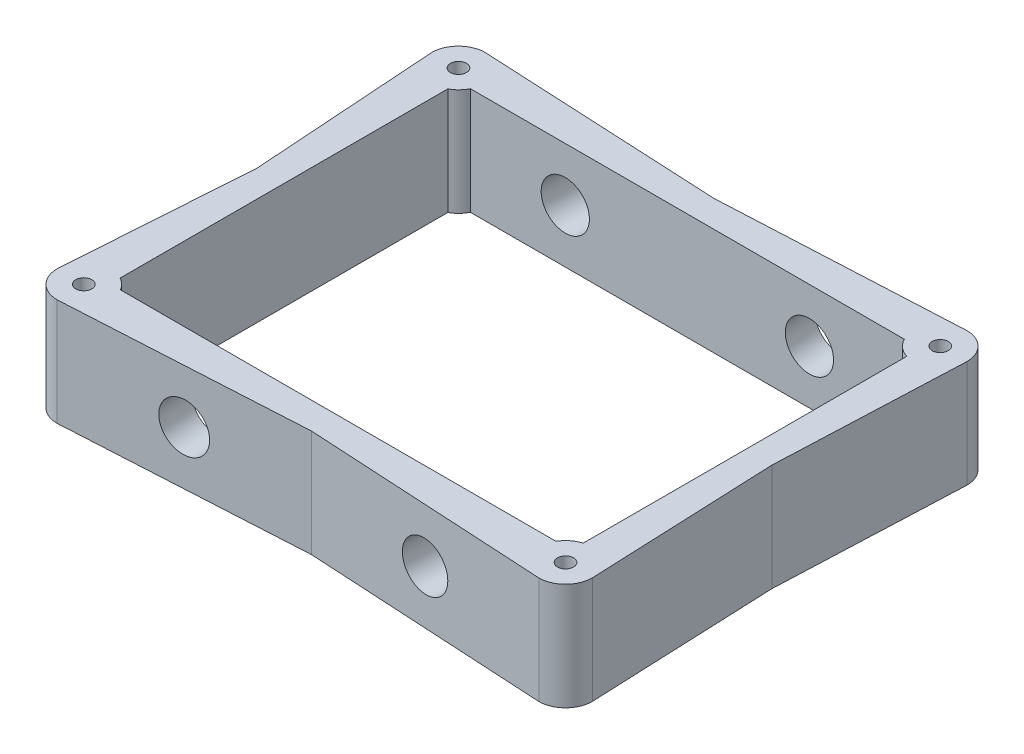
ISO-10303-21;
HEADER;
FILE_DESCRIPTION(('STEP AP214'),'2;1');
FILE_NAME('part.step','',(''),(''),'','','');
FILE_SCHEMA(('AUTOMOTIVE_DESIGN { 1 0 10303 214 1 1 1 1 }'));
ENDSEC;
DATA;
#1=APPLICATION_CONTEXT('core data for automotive mechanical design processes');
#2=APPLICATION_PROTOCOL_DEFINITION('international standard','automotive_design',2000,#1);
#3=PRODUCT_CONTEXT('',#1,'mechanical');
#4=PRODUCT('Part','Part','',(#3));
#5=PRODUCT_RELATED_PRODUCT_CATEGORY('part','',(#4));
#6=PRODUCT_DEFINITION_FORMATION('','',#4);
#7=PRODUCT_DEFINITION_CONTEXT('part definition',#1,'design');
#8=PRODUCT_DEFINITION('design','',#6,#7);
#9=PRODUCT_DEFINITION_SHAPE('','',#8);
#10=(LENGTH_UNIT() NAMED_UNIT(*) SI_UNIT(.MILLI.,.METRE.));
#11=(NAMED_UNIT(*) PLANE_ANGLE_UNIT() SI_UNIT($,.RADIAN.));
#12=(NAMED_UNIT(*) SI_UNIT($,.STERADIAN.) SOLID_ANGLE_UNIT());
#13=UNCERTAINTY_MEASURE_WITH_UNIT(LENGTH_MEASURE(1.E-05),#10,'distance_accuracy_value','');
#14=(GEOMETRIC_REPRESENTATION_CONTEXT(3) GLOBAL_UNCERTAINTY_ASSIGNED_CONTEXT((#13)) GLOBAL_UNIT_ASSIGNED_CONTEXT((#10,
#11,#12)) REPRESENTATION_CONTEXT('',''));
#15=CARTESIAN_POINT('',(0.,0.,0.));
#16=DIRECTION('',(0.,0.,1.));
#17=DIRECTION('',(1.,0.,0.));
#18=AXIS2_PLACEMENT_3D('',#15,#16,#17);
#19=CARTESIAN_POINT('',(-1.87638591590573,20.,-37.6647051964881));
#20=DIRECTION('',(0.049756443837666,0.,0.998761381059875));
#21=DIRECTION('',(0.998761381059875,0.,-0.049756443837666));
#22=AXIS2_PLACEMENT_3D('',#19,#20,#21);
#23=PLANE('',#22);
#24=DIRECTION('',(-0.998761381059875,0.,0.049756443837666));
#25=VECTOR('',#24,1.);
#26=CARTESIAN_POINT('',(-1.87638591590573,0.,-37.6647051964881));
#27=LINE('',#26,#25);
#28=CARTESIAN_POINT('',(45.,0.,-40.));
#29=VERTEX_POINT('',#28);
#30=CARTESIAN_POINT('',(1.31422650540003E-11,0.,-37.7581832706444));
#31=VERTEX_POINT('',#30);
#32=EDGE_CURVE('E273',#29,#31,#27,.T.);
#33=ORIENTED_EDGE('',*,*,#32,.T.);
#34=DIRECTION('',(0.,-1.,0.));
#35=VECTOR('',#34,1.);
#36=CARTESIAN_POINT('',(1.31422650540003E-11,20.,-37.7581832706444));
#37=LINE('',#36,#35);
#38=CARTESIAN_POINT('',(1.31422650540003E-11,20.,-37.7581832706444));
#39=VERTEX_POINT('',#38);
#40=EDGE_CURVE('E195',#39,#31,#37,.T.);
#41=ORIENTED_EDGE('',*,*,#40,.F.);
#42=DIRECTION('',(-0.998761381059875,0.,0.049756443837666));
#43=VECTOR('',#42,1.);
#44=CARTESIAN_POINT('',(-1.87638591590573,20.,-37.6647051964881));
#45=LINE('',#44,#43);
#46=CARTESIAN_POINT('',(45.,20.,-40.));
#47=VERTEX_POINT('',#46);
#48=EDGE_CURVE('E204',#47,#39,#45,.T.);
#49=ORIENTED_EDGE('',*,*,#48,.F.);
#50=DIRECTION('',(0.,-1.,0.));
#51=VECTOR('',#50,1.);
#52=CARTESIAN_POINT('',(45.,20.,-40.));
#53=LINE('',#52,#51);
#54=EDGE_CURVE('E284',#47,#29,#53,.T.);
#55=ORIENTED_EDGE('',*,*,#54,.T.);
#56=EDGE_LOOP('',(#33,#41,#49,#55));
#57=FACE_BOUND('',#56,.T.);
#58=CARTESIAN_POINT('',(22.5000000000066,10.,-38.8790916353222));
#59=DIRECTION('',(-0.049756443837666,0.,-0.998761381059875));
#60=DIRECTION('',(-0.998761381059875,0.,0.049756443837666));
#61=AXIS2_PLACEMENT_3D('',#58,#59,#60);
#62=CIRCLE('',#61,4.49999999999999);
#63=CARTESIAN_POINT('',(18.0055737852371,10.,-38.6551876380527));
#64=VERTEX_POINT('',#63);
#65=EDGE_CURVE('E519',#64,#64,#62,.T.);
#66=ORIENTED_EDGE('',*,*,#65,.F.);
#67=EDGE_LOOP('',(#66));
#68=FACE_BOUND('',#67,.T.);
#69=ADVANCED_FACE('F37',(#57,#68),#23,.F.);
#70=CARTESIAN_POINT('',(2.0973133440241,20.,37.3557534050209));
#71=DIRECTION('',(-0.0560560392466513,0.,-0.998427624048923));
#72=DIRECTION('',(-0.998427624048923,0.,0.0560560392466513));
#73=AXIS2_PLACEMENT_3D('',#70,#71,#72);
#74=PLANE('',#73);
#75=DIRECTION('',(0.998427624048923,0.,-0.0560560392466513));
#76=VECTOR('',#75,1.);
#77=CARTESIAN_POINT('',(2.0973133440241,0.,37.3557534050209));
#78=LINE('',#77,#76);
#79=CARTESIAN_POINT('',(-45.,0.,40.));
#80=VERTEX_POINT('',#79);
#81=CARTESIAN_POINT('',(0.,0.,37.4735056349205));
#82=VERTEX_POINT('',#81);
#83=EDGE_CURVE('E255',#80,#82,#78,.T.);
#84=ORIENTED_EDGE('',*,*,#83,.T.);
#85=DIRECTION('',(0.,-1.,0.));
#86=VECTOR('',#85,1.);
#87=CARTESIAN_POINT('',(0.,20.,37.4735056349205));
#88=LINE('',#87,#86);
#89=CARTESIAN_POINT('',(0.,20.,37.4735056349205));
#90=VERTEX_POINT('',#89);
#91=EDGE_CURVE('E299',#90,#82,#88,.T.);
#92=ORIENTED_EDGE('',*,*,#91,.F.);
#93=DIRECTION('',(0.998427624048923,0.,-0.0560560392466513));
#94=VECTOR('',#93,1.);
#95=CARTESIAN_POINT('',(2.0973133440241,20.,37.3557534050209));
#96=LINE('',#95,#94);
#97=CARTESIAN_POINT('',(-45.,20.,40.));
#98=VERTEX_POINT('',#97);
#99=EDGE_CURVE('E376',#98,#90,#96,.T.);
#100=ORIENTED_EDGE('',*,*,#99,.F.);
#101=DIRECTION('',(0.,-1.,0.));
#102=VECTOR('',#101,1.);
#103=CARTESIAN_POINT('',(-45.,20.,40.));
#104=LINE('',#103,#102);
#105=EDGE_CURVE('E47',#98,#80,#104,.T.);
#106=ORIENTED_EDGE('',*,*,#105,.T.);
#107=EDGE_LOOP('',(#84,#92,#100,#106));
#108=FACE_BOUND('',#107,.T.);
#109=CARTESIAN_POINT('',(-22.5,10.,38.7367528174603));
#110=DIRECTION('',(0.0560560392466513,0.,0.998427624048923));
#111=DIRECTION('',(0.998427624048923,0.,-0.0560560392466513));
#112=AXIS2_PLACEMENT_3D('',#109,#110,#111);
#113=CIRCLE('',#112,4.49999999999999);
#114=CARTESIAN_POINT('',(-18.0070756917799,10.,38.4845006408503));
#115=VERTEX_POINT('',#114);
#116=EDGE_CURVE('E507',#115,#115,#113,.T.);
#117=ORIENTED_EDGE('',*,*,#116,.F.);
#118=EDGE_LOOP('',(#117));
#119=FACE_BOUND('',#118,.T.);
#120=ADVANCED_FACE('F414',(#108,#119),#74,.F.);
#121=CARTESIAN_POINT('',(-47.3900773621706,20.,-3.2348603977943));
#122=DIRECTION('',(-0.997678376445637,0.,-0.0681018147540725));
#123=DIRECTION('',(-0.0681018147540725,0.,0.997678376445637));
#124=AXIS2_PLACEMENT_3D('',#121,#122,#123);
#125=PLANE('',#124);
#126=DIRECTION('',(0.0681018147540725,0.,-0.997678376445637));
#127=VECTOR('',#126,1.);
#128=CARTESIAN_POINT('',(-47.3900773621706,0.,-3.2348603977943));
#129=LINE('',#128,#127);
#130=CARTESIAN_POINT('',(-50.,0.,35.));
#131=VERTEX_POINT('',#130);
#132=CARTESIAN_POINT('',(-47.6108898692542,0.,3.7470027081099E-12));
#133=VERTEX_POINT('',#132);
#134=EDGE_CURVE('E250',#131,#133,#129,.T.);
#135=ORIENTED_EDGE('',*,*,#134,.F.);
#136=DIRECTION('',(0.,-1.,0.));
#137=VECTOR('',#136,1.);
#138=CARTESIAN_POINT('',(-50.,20.,35.));
#139=LINE('',#138,#137);
#140=CARTESIAN_POINT('',(-50.,20.,35.));
#141=VERTEX_POINT('',#140);
#142=EDGE_CURVE('E11',#141,#131,#139,.T.);
#143=ORIENTED_EDGE('',*,*,#142,.F.);
#144=DIRECTION('',(0.0681018147540725,0.,-0.997678376445637));
#145=VECTOR('',#144,1.);
#146=CARTESIAN_POINT('',(-47.3900773621706,20.,-3.2348603977943));
#147=LINE('',#146,#145);
#148=CARTESIAN_POINT('',(-47.6108898692542,20.,3.7470027081099E-12));
#149=VERTEX_POINT('',#148);
#150=EDGE_CURVE('E371',#141,#149,#147,.T.);
#151=ORIENTED_EDGE('',*,*,#150,.T.);
#152=DIRECTION('',(0.,-1.,0.));
#153=VECTOR('',#152,1.);
#154=CARTESIAN_POINT('',(-47.6108898692542,20.,3.7470027081099E-12));
#155=LINE('',#154,#153);
#156=EDGE_CURVE('E127',#149,#133,#155,.T.);
#157=ORIENTED_EDGE('',*,*,#156,.T.);
#158=EDGE_LOOP('',(#135,#143,#151,#157));
#159=FACE_BOUND('',#158,.T.);
#160=ADVANCED_FACE('F419',(#159),#125,.T.);
#161=CARTESIAN_POINT('',(-45.,20.,35.));
#162=DIRECTION('',(0.,-1.,0.));
#163=DIRECTION('',(0.,0.,-1.));
#164=AXIS2_PLACEMENT_3D('',#161,#162,#163);
#165=CYLINDRICAL_SURFACE('',#164,5.);
#166=CARTESIAN_POINT('',(-45.,0.,35.));
#167=DIRECTION('',(0.,1.,0.));
#168=DIRECTION('',(0.,0.,1.));
#169=AXIS2_PLACEMENT_3D('',#166,#167,#168);
#170=CIRCLE('',#169,5.);
#171=EDGE_CURVE('E252',#131,#80,#170,.T.);
#172=ORIENTED_EDGE('',*,*,#171,.T.);
#173=ORIENTED_EDGE('',*,*,#105,.F.);
#174=CARTESIAN_POINT('',(-45.,20.,35.));
#175=DIRECTION('',(0.,1.,0.));
#176=DIRECTION('',(0.,0.,1.));
#177=AXIS2_PLACEMENT_3D('',#174,#175,#176);
#178=CIRCLE('',#177,5.);
#179=EDGE_CURVE('E373',#141,#98,#178,.T.);
#180=ORIENTED_EDGE('',*,*,#179,.F.);
#181=ORIENTED_EDGE('',*,*,#142,.T.);
#182=EDGE_LOOP('',(#172,#173,#180,#181));
#183=FACE_BOUND('',#182,.T.);
#184=ADVANCED_FACE('F441',(#183),#165,.T.);
#185=CARTESIAN_POINT('',(-2.0973133440241,20.,37.3557534050209));
#186=DIRECTION('',(0.0560560392466513,0.,-0.998427624048923));
#187=DIRECTION('',(-0.998427624048923,0.,-0.0560560392466513));
#188=AXIS2_PLACEMENT_3D('',#185,#186,#187);
#189=PLANE('',#188);
#190=CARTESIAN_POINT('',(22.5,10.,38.7367528174603));
#191=DIRECTION('',(-0.0560560392466514,0.,0.998427624048923));
#192=DIRECTION('',(0.998427624048923,0.,0.0560560392466514));
#193=AXIS2_PLACEMENT_3D('',#190,#191,#192);
#194=CIRCLE('',#193,4.49999999999999);
#195=CARTESIAN_POINT('',(26.9929243082201,10.,38.9890049940702));
#196=VERTEX_POINT('',#195);
#197=EDGE_CURVE('E513',#196,#196,#194,.T.);
#198=ORIENTED_EDGE('',*,*,#197,.F.);
#199=EDGE_LOOP('',(#198));
#200=FACE_BOUND('',#199,.T.);
#201=DIRECTION('',(0.998427624048923,0.,0.0560560392466514));
#202=VECTOR('',#201,1.);
#203=CARTESIAN_POINT('',(-2.0973133440241,0.,37.3557534050209));
#204=LINE('',#203,#202);
#205=CARTESIAN_POINT('',(45.,0.,40.));
#206=VERTEX_POINT('',#205);
#207=EDGE_CURVE('E258',#82,#206,#204,.T.);
#208=ORIENTED_EDGE('',*,*,#207,.T.);
#209=DIRECTION('',(0.,-1.,0.));
#210=VECTOR('',#209,1.);
#211=CARTESIAN_POINT('',(45.,20.,40.));
#212=LINE('',#211,#210);
#213=CARTESIAN_POINT('',(45.,20.,40.));
#214=VERTEX_POINT('',#213);
#215=EDGE_CURVE('E296',#214,#206,#212,.T.);
#216=ORIENTED_EDGE('',*,*,#215,.F.);
#217=DIRECTION('',(0.998427624048923,0.,0.0560560392466514));
#218=VECTOR('',#217,1.);
#219=CARTESIAN_POINT('',(-2.0973133440241,20.,37.3557534050209));
#220=LINE('',#219,#218);
#221=EDGE_CURVE('E379',#90,#214,#220,.T.);
#222=ORIENTED_EDGE('',*,*,#221,.F.);
#223=ORIENTED_EDGE('',*,*,#91,.T.);
#224=EDGE_LOOP('',(#208,#216,#222,#223));
#225=FACE_BOUND('',#224,.T.);
#226=ADVANCED_FACE('F438',(#200,#225),#189,.F.);
#227=CARTESIAN_POINT('',(45.,20.,35.));
#228=DIRECTION('',(0.,-1.,0.));
#229=DIRECTION('',(0.,0.,-1.));
#230=AXIS2_PLACEMENT_3D('',#227,#228,#229);
#231=CYLINDRICAL_SURFACE('',#230,4.99999999999999);
#232=CARTESIAN_POINT('',(45.,0.,35.));
#233=DIRECTION('',(0.,1.,0.));
#234=DIRECTION('',(0.,0.,1.));
#235=AXIS2_PLACEMENT_3D('',#232,#233,#234);
#236=CIRCLE('',#235,4.99999999999999);
#237=CARTESIAN_POINT('',(50.,0.,35.));
#238=VERTEX_POINT('',#237);
#239=EDGE_CURVE('E261',#206,#238,#236,.T.);
#240=ORIENTED_EDGE('',*,*,#239,.T.);
#241=DIRECTION('',(0.,-1.,0.));
#242=VECTOR('',#241,1.);
#243=CARTESIAN_POINT('',(50.,20.,35.));
#244=LINE('',#243,#242);
#245=CARTESIAN_POINT('',(50.,20.,35.));
#246=VERTEX_POINT('',#245);
#247=EDGE_CURVE('E293',#246,#238,#244,.T.);
#248=ORIENTED_EDGE('',*,*,#247,.F.);
#249=CARTESIAN_POINT('',(45.,20.,35.));
#250=DIRECTION('',(0.,1.,0.));
#251=DIRECTION('',(0.,0.,1.));
#252=AXIS2_PLACEMENT_3D('',#249,#250,#251);
#253=CIRCLE('',#252,4.99999999999999);
#254=EDGE_CURVE('E382',#214,#246,#253,.T.);
#255=ORIENTED_EDGE('',*,*,#254,.F.);
#256=ORIENTED_EDGE('',*,*,#215,.T.);
#257=EDGE_LOOP('',(#240,#248,#255,#256));
#258=FACE_BOUND('',#257,.T.);
#259=ADVANCED_FACE('F434',(#258),#231,.T.);
#260=CARTESIAN_POINT('',(48.4436627956674,20.,-2.03572815952969));
#261=DIRECTION('',(-0.999118218662636,0.,0.0419855348471417));
#262=DIRECTION('',(0.0419855348471417,0.,0.999118218662636));
#263=AXIS2_PLACEMENT_3D('',#260,#261,#262);
#264=PLANE('',#263);
#265=DIRECTION('',(-0.0419855348471417,0.,-0.999118218662636));
#266=VECTOR('',#265,1.);
#267=CARTESIAN_POINT('',(48.4436627956674,0.,-2.03572815952969));
#268=LINE('',#267,#266);
#269=CARTESIAN_POINT('',(48.5292093646171,0.,1.28226422535516E-11));
#270=VERTEX_POINT('',#269);
#271=EDGE_CURVE('E264',#238,#270,#268,.T.);
#272=ORIENTED_EDGE('',*,*,#271,.T.);
#273=DIRECTION('',(0.,-1.,0.));
#274=VECTOR('',#273,1.);
#275=CARTESIAN_POINT('',(48.5292093646171,20.,1.28226422535516E-11));
#276=LINE('',#275,#274);
#277=CARTESIAN_POINT('',(48.5292093646171,20.,1.28226422535516E-11));
#278=VERTEX_POINT('',#277);
#279=EDGE_CURVE('E290',#278,#270,#276,.T.);
#280=ORIENTED_EDGE('',*,*,#279,.F.);
#281=DIRECTION('',(-0.0419855348471417,0.,-0.999118218662636));
#282=VECTOR('',#281,1.);
#283=CARTESIAN_POINT('',(48.4436627956674,20.,-2.03572815952969));
#284=LINE('',#283,#282);
#285=EDGE_CURVE('E385',#246,#278,#284,.T.);
#286=ORIENTED_EDGE('',*,*,#285,.F.);
#287=ORIENTED_EDGE('',*,*,#247,.T.);
#288=EDGE_LOOP('',(#272,#280,#286,#287));
#289=FACE_BOUND('',#288,.T.);
#290=ADVANCED_FACE('F430',(#289),#264,.F.);
#291=CARTESIAN_POINT('',(48.4436627956686,20.,2.03572815952825));
#292=DIRECTION('',(-0.999118218662638,0.,-0.041985534847111));
#293=DIRECTION('',(-0.041985534847111,0.,0.999118218662638));
#294=AXIS2_PLACEMENT_3D('',#291,#292,#293);
#295=PLANE('',#294);
#296=DIRECTION('',(0.041985534847111,0.,-0.999118218662638));
#297=VECTOR('',#296,1.);
#298=CARTESIAN_POINT('',(48.4436627956686,0.,2.03572815952825));
#299=LINE('',#298,#297);
#300=CARTESIAN_POINT('',(50.,0.,-35.));
#301=VERTEX_POINT('',#300);
#302=EDGE_CURVE('E267',#270,#301,#299,.T.);
#303=ORIENTED_EDGE('',*,*,#302,.T.);
#304=DIRECTION('',(0.,-1.,0.));
#305=VECTOR('',#304,1.);
#306=CARTESIAN_POINT('',(50.,20.,-35.));
#307=LINE('',#306,#305);
#308=CARTESIAN_POINT('',(50.,20.,-35.));
#309=VERTEX_POINT('',#308);
#310=EDGE_CURVE('E287',#309,#301,#307,.T.);
#311=ORIENTED_EDGE('',*,*,#310,.F.);
#312=DIRECTION('',(0.041985534847111,0.,-0.999118218662638));
#313=VECTOR('',#312,1.);
#314=CARTESIAN_POINT('',(48.4436627956686,20.,2.03572815952825));
#315=LINE('',#314,#313);
#316=EDGE_CURVE('E388',#278,#309,#315,.T.);
#317=ORIENTED_EDGE('',*,*,#316,.F.);
#318=ORIENTED_EDGE('',*,*,#279,.T.);
#319=EDGE_LOOP('',(#303,#311,#317,#318));
#320=FACE_BOUND('',#319,.T.);
#321=ADVANCED_FACE('F427',(#320),#295,.F.);
#322=CARTESIAN_POINT('',(45.,20.,-35.));
#323=DIRECTION('',(0.,-1.,0.));
#324=DIRECTION('',(0.,0.,-1.));
#325=AXIS2_PLACEMENT_3D('',#322,#323,#324);
#326=CYLINDRICAL_SURFACE('',#325,5.);
#327=CARTESIAN_POINT('',(45.,0.,-35.));
#328=DIRECTION('',(0.,1.,0.));
#329=DIRECTION('',(0.,0.,1.));
#330=AXIS2_PLACEMENT_3D('',#327,#328,#329);
#331=CIRCLE('',#330,5.);
#332=EDGE_CURVE('E270',#301,#29,#331,.T.);
#333=ORIENTED_EDGE('',*,*,#332,.T.);
#334=ORIENTED_EDGE('',*,*,#54,.F.);
#335=CARTESIAN_POINT('',(45.,20.,-35.));
#336=DIRECTION('',(0.,1.,0.));
#337=DIRECTION('',(0.,0.,1.));
#338=AXIS2_PLACEMENT_3D('',#335,#336,#337);
#339=CIRCLE('',#338,5.);
#340=EDGE_CURVE('E207',#309,#47,#339,.T.);
#341=ORIENTED_EDGE('',*,*,#340,.F.);
#342=ORIENTED_EDGE('',*,*,#310,.T.);
#343=EDGE_LOOP('',(#333,#334,#341,#342));
#344=FACE_BOUND('',#343,.T.);
#345=ADVANCED_FACE('F393',(#344),#326,.T.);
#346=CARTESIAN_POINT('',(1.8763859159047,20.,-37.6647051964895));
#347=DIRECTION('',(0.049756443837637,0.,-0.998761381059877));
#348=DIRECTION('',(-0.998761381059877,0.,-0.049756443837637));
#349=AXIS2_PLACEMENT_3D('',#346,#347,#348);
#350=PLANE('',#349);
#351=CARTESIAN_POINT('',(-22.4999999999934,10.,-38.8790916353222));
#352=DIRECTION('',(0.049756443837637,0.,-0.998761381059877));
#353=DIRECTION('',(-0.998761381059877,0.,-0.049756443837637));
#354=AXIS2_PLACEMENT_3D('',#351,#352,#353);
#355=CIRCLE('',#354,4.49999999999999);
#356=CARTESIAN_POINT('',(-26.9944262147629,10.,-39.1029956325916));
#357=VERTEX_POINT('',#356);
#358=EDGE_CURVE('E525',#357,#357,#355,.T.);
#359=ORIENTED_EDGE('',*,*,#358,.F.);
#360=EDGE_LOOP('',(#359));
#361=FACE_BOUND('',#360,.T.);
#362=DIRECTION('',(0.998761381059877,0.,0.049756443837637));
#363=VECTOR('',#362,1.);
#364=CARTESIAN_POINT('',(1.8763859159047,0.,-37.6647051964895));
#365=LINE('',#364,#363);
#366=CARTESIAN_POINT('',(-45.,0.,-40.));
#367=VERTEX_POINT('',#366);
#368=EDGE_CURVE('E192',#367,#31,#365,.T.);
#369=ORIENTED_EDGE('',*,*,#368,.F.);
#370=DIRECTION('',(0.,-1.,0.));
#371=VECTOR('',#370,1.);
#372=CARTESIAN_POINT('',(-45.,20.,-40.));
#373=LINE('',#372,#371);
#374=CARTESIAN_POINT('',(-45.,20.,-40.));
#375=VERTEX_POINT('',#374);
#376=EDGE_CURVE('E186',#375,#367,#373,.T.);
#377=ORIENTED_EDGE('',*,*,#376,.F.);
#378=DIRECTION('',(0.998761381059877,0.,0.049756443837637));
#379=VECTOR('',#378,1.);
#380=CARTESIAN_POINT('',(1.8763859159047,20.,-37.6647051964895));
#381=LINE('',#380,#379);
#382=EDGE_CURVE('E190',#375,#39,#381,.T.);
#383=ORIENTED_EDGE('',*,*,#382,.T.);
#384=ORIENTED_EDGE('',*,*,#40,.T.);
#385=EDGE_LOOP('',(#369,#377,#383,#384));
#386=FACE_BOUND('',#385,.T.);
#387=ADVANCED_FACE('F188',(#361,#386),#350,.T.);
#388=CARTESIAN_POINT('',(-45.,20.,-35.));
#389=DIRECTION('',(0.,-1.,0.));
#390=DIRECTION('',(0.,0.,-1.));
#391=AXIS2_PLACEMENT_3D('',#388,#389,#390);
#392=CYLINDRICAL_SURFACE('',#391,4.99999999999999);
#393=CARTESIAN_POINT('',(-45.,0.,-35.));
#394=DIRECTION('',(0.,1.,0.));
#395=DIRECTION('',(0.,0.,1.));
#396=AXIS2_PLACEMENT_3D('',#393,#394,#395);
#397=CIRCLE('',#396,4.99999999999999);
#398=CARTESIAN_POINT('',(-50.,0.,-35.));
#399=VERTEX_POINT('',#398);
#400=EDGE_CURVE('E277',#367,#399,#397,.T.);
#401=ORIENTED_EDGE('',*,*,#400,.T.);
#402=DIRECTION('',(0.,-1.,0.));
#403=VECTOR('',#402,1.);
#404=CARTESIAN_POINT('',(-50.,20.,-35.));
#405=LINE('',#404,#403);
#406=CARTESIAN_POINT('',(-50.,20.,-35.));
#407=VERTEX_POINT('',#406);
#408=EDGE_CURVE('E196',#407,#399,#405,.T.);
#409=ORIENTED_EDGE('',*,*,#408,.F.);
#410=CARTESIAN_POINT('',(-45.,20.,-35.));
#411=DIRECTION('',(0.,1.,0.));
#412=DIRECTION('',(0.,0.,1.));
#413=AXIS2_PLACEMENT_3D('',#410,#411,#412);
#414=CIRCLE('',#413,4.99999999999999);
#415=EDGE_CURVE('E199',#375,#407,#414,.T.);
#416=ORIENTED_EDGE('',*,*,#415,.F.);
#417=ORIENTED_EDGE('',*,*,#376,.T.);
#418=EDGE_LOOP('',(#401,#409,#416,#417));
#419=FACE_BOUND('',#418,.T.);
#420=ADVANCED_FACE('F200',(#419),#392,.T.);
#421=CARTESIAN_POINT('',(43.5292093646171,20.,0.));
#422=DIRECTION('',(-1.,0.,0.));
#423=DIRECTION('',(0.,0.,1.));
#424=AXIS2_PLACEMENT_3D('',#421,#422,#423);
#425=PLANE('',#424);
#426=DIRECTION('',(0.,0.,-1.));
#427=VECTOR('',#426,1.);
#428=CARTESIAN_POINT('',(43.5292093646171,0.,0.));
#429=LINE('',#428,#427);
#430=CARTESIAN_POINT('',(43.5292093646171,0.,30.2212161686398));
#431=VERTEX_POINT('',#430);
#432=CARTESIAN_POINT('',(43.5292093646171,0.,-30.2212161686398));
#433=VERTEX_POINT('',#432);
#434=EDGE_CURVE('E226',#431,#433,#429,.T.);
#435=ORIENTED_EDGE('',*,*,#434,.F.);
#436=DIRECTION('',(0.,-1.,0.));
#437=VECTOR('',#436,1.);
#438=CARTESIAN_POINT('',(43.5292093646171,20.,30.2212161686398));
#439=LINE('',#438,#437);
#440=CARTESIAN_POINT('',(43.5292093646171,20.,30.2212161686398));
#441=VERTEX_POINT('',#440);
#442=EDGE_CURVE('E41',#441,#431,#439,.T.);
#443=ORIENTED_EDGE('',*,*,#442,.F.);
#444=DIRECTION('',(0.,0.,-1.));
#445=VECTOR('',#444,1.);
#446=CARTESIAN_POINT('',(43.5292093646171,20.,0.));
#447=LINE('',#446,#445);
#448=CARTESIAN_POINT('',(43.5292093646171,20.,-30.2212161686398));
#449=VERTEX_POINT('',#448);
#450=EDGE_CURVE('E333',#441,#449,#447,.T.);
#451=ORIENTED_EDGE('',*,*,#450,.T.);
#452=DIRECTION('',(0.,-1.,0.));
#453=VECTOR('',#452,1.);
#454=CARTESIAN_POINT('',(43.5292093646171,20.,-30.2212161686398));
#455=LINE('',#454,#453);
#456=EDGE_CURVE('E212',#449,#433,#455,.T.);
#457=ORIENTED_EDGE('',*,*,#456,.T.);
#458=EDGE_LOOP('',(#435,#443,#451,#457));
#459=FACE_BOUND('',#458,.T.);
#460=ADVANCED_FACE('F331',(#459),#425,.T.);
#461=CARTESIAN_POINT('',(45.,20.,35.));
#462=DIRECTION('',(0.,-1.,0.));
#463=DIRECTION('',(0.,0.,-1.));
#464=AXIS2_PLACEMENT_3D('',#461,#462,#463);
#465=CYLINDRICAL_SURFACE('',#464,5.);
#466=CARTESIAN_POINT('',(45.,0.,35.));
#467=DIRECTION('',(0.,1.,0.));
#468=DIRECTION('',(0.,0.,1.));
#469=AXIS2_PLACEMENT_3D('',#466,#467,#468);
#470=CIRCLE('',#469,5.);
#471=CARTESIAN_POINT('',(40.6852779668649,0.,32.4735056349205));
#472=VERTEX_POINT('',#471);
#473=EDGE_CURVE('E229',#431,#472,#470,.T.);
#474=ORIENTED_EDGE('',*,*,#473,.T.);
#475=DIRECTION('',(0.,-1.,0.));
#476=VECTOR('',#475,1.);
#477=CARTESIAN_POINT('',(40.6852779668649,20.,32.4735056349205));
#478=LINE('',#477,#476);
#479=CARTESIAN_POINT('',(40.6852779668649,20.,32.4735056349205));
#480=VERTEX_POINT('',#479);
#481=EDGE_CURVE('E318',#480,#472,#478,.T.);
#482=ORIENTED_EDGE('',*,*,#481,.F.);
#483=CARTESIAN_POINT('',(45.,20.,35.));
#484=DIRECTION('',(0.,1.,0.));
#485=DIRECTION('',(0.,0.,1.));
#486=AXIS2_PLACEMENT_3D('',#483,#484,#485);
#487=CIRCLE('',#486,5.);
#488=EDGE_CURVE('E326',#441,#480,#487,.T.);
#489=ORIENTED_EDGE('',*,*,#488,.F.);
#490=ORIENTED_EDGE('',*,*,#442,.T.);
#491=EDGE_LOOP('',(#474,#482,#489,#490));
#492=FACE_BOUND('',#491,.T.);
#493=ADVANCED_FACE('F325',(#492),#465,.T.);
#494=CARTESIAN_POINT('',(0.,20.,32.4735056349205));
#495=DIRECTION('',(0.,0.,-1.));
#496=DIRECTION('',(-1.,0.,0.));
#497=AXIS2_PLACEMENT_3D('',#494,#495,#496);
#498=PLANE('',#497);
#499=CARTESIAN_POINT('',(22.8516457491952,10.,32.4735056349205));
#500=DIRECTION('',(0.,0.,-1.));
#501=DIRECTION('',(-1.,0.,0.));
#502=AXIS2_PLACEMENT_3D('',#499,#500,#501);
#503=ELLIPSE('',#502,4.50708683494868,4.49999999999999);
#504=CARTESIAN_POINT('',(18.3445589142466,10.,32.4735056349205));
#505=VERTEX_POINT('',#504);
#506=EDGE_CURVE('E510',#505,#505,#503,.T.);
#507=ORIENTED_EDGE('',*,*,#506,.F.);
#508=EDGE_LOOP('',(#507));
#509=FACE_BOUND('',#508,.T.);
#510=CARTESIAN_POINT('',(-22.8516457491953,10.,32.4735056349205));
#511=DIRECTION('',(0.,0.,-1.));
#512=DIRECTION('',(1.,0.,0.));
#513=AXIS2_PLACEMENT_3D('',#510,#511,#512);
#514=ELLIPSE('',#513,4.50708683494868,4.49999999999999);
#515=CARTESIAN_POINT('',(-18.3445589142466,10.,32.4735056349205));
#516=VERTEX_POINT('',#515);
#517=EDGE_CURVE('E217',#516,#516,#514,.T.);
#518=ORIENTED_EDGE('',*,*,#517,.F.);
#519=EDGE_LOOP('',(#518));
#520=FACE_BOUND('',#519,.T.);
#521=DIRECTION('',(1.,0.,0.));
#522=VECTOR('',#521,1.);
#523=CARTESIAN_POINT('',(0.,0.,32.4735056349205));
#524=LINE('',#523,#522);
#525=CARTESIAN_POINT('',(-40.6852779668649,0.,32.4735056349205));
#526=VERTEX_POINT('',#525);
#527=EDGE_CURVE('E232',#526,#472,#524,.T.);
#528=ORIENTED_EDGE('',*,*,#527,.F.);
#529=DIRECTION('',(0.,-1.,0.));
#530=VECTOR('',#529,1.);
#531=CARTESIAN_POINT('',(-40.6852779668649,20.,32.4735056349205));
#532=LINE('',#531,#530);
#533=CARTESIAN_POINT('',(-40.6852779668649,20.,32.4735056349205));
#534=VERTEX_POINT('',#533);
#535=EDGE_CURVE('E317',#534,#526,#532,.T.);
#536=ORIENTED_EDGE('',*,*,#535,.F.);
#537=DIRECTION('',(1.,0.,0.));
#538=VECTOR('',#537,1.);
#539=CARTESIAN_POINT('',(0.,20.,32.4735056349205));
#540=LINE('',#539,#538);
#541=EDGE_CURVE('E355',#534,#480,#540,.T.);
#542=ORIENTED_EDGE('',*,*,#541,.T.);
#543=ORIENTED_EDGE('',*,*,#481,.T.);
#544=EDGE_LOOP('',(#528,#536,#542,#543));
#545=FACE_BOUND('',#544,.T.);
#546=ADVANCED_FACE('F352',(#509,#520,#545),#498,.T.);
#547=CARTESIAN_POINT('',(-45.,20.,35.));
#548=DIRECTION('',(0.,-1.,0.));
#549=DIRECTION('',(0.,0.,-1.));
#550=AXIS2_PLACEMENT_3D('',#547,#548,#549);
#551=CYLINDRICAL_SURFACE('',#550,4.99999999999999);
#552=CARTESIAN_POINT('',(-45.,0.,35.));
#553=DIRECTION('',(0.,1.,0.));
#554=DIRECTION('',(0.,0.,1.));
#555=AXIS2_PLACEMENT_3D('',#552,#553,#554);
#556=CIRCLE('',#555,4.99999999999999);
#557=CARTESIAN_POINT('',(-42.6108898692542,0.,30.6077166777213));
#558=VERTEX_POINT('',#557);
#559=EDGE_CURVE('E235',#526,#558,#556,.T.);
#560=ORIENTED_EDGE('',*,*,#559,.T.);
#561=DIRECTION('',(0.,-1.,0.));
#562=VECTOR('',#561,1.);
#563=CARTESIAN_POINT('',(-42.6108898692542,20.,30.6077166777213));
#564=LINE('',#563,#562);
#565=CARTESIAN_POINT('',(-42.6108898692542,20.,30.6077166777213));
#566=VERTEX_POINT('',#565);
#567=EDGE_CURVE('E314',#566,#558,#564,.T.);
#568=ORIENTED_EDGE('',*,*,#567,.F.);
#569=CARTESIAN_POINT('',(-45.,20.,35.));
#570=DIRECTION('',(0.,1.,0.));
#571=DIRECTION('',(0.,0.,1.));
#572=AXIS2_PLACEMENT_3D('',#569,#570,#571);
#573=CIRCLE('',#572,4.99999999999999);
#574=EDGE_CURVE('E357',#534,#566,#573,.T.);
#575=ORIENTED_EDGE('',*,*,#574,.F.);
#576=ORIENTED_EDGE('',*,*,#535,.T.);
#577=EDGE_LOOP('',(#560,#568,#575,#576));
#578=FACE_BOUND('',#577,.T.);
#579=ADVANCED_FACE('F358',(#578),#551,.T.);
#580=CARTESIAN_POINT('',(-42.6108898692542,20.,0.));
#581=DIRECTION('',(-1.,0.,0.));
#582=DIRECTION('',(0.,0.,1.));
#583=AXIS2_PLACEMENT_3D('',#580,#581,#582);
#584=PLANE('',#583);
#585=DIRECTION('',(0.,0.,-1.));
#586=VECTOR('',#585,1.);
#587=CARTESIAN_POINT('',(-42.6108898692542,0.,0.));
#588=LINE('',#587,#586);
#589=CARTESIAN_POINT('',(-42.6108898692542,0.,-30.6077166777213));
#590=VERTEX_POINT('',#589);
#591=EDGE_CURVE('E238',#558,#590,#588,.T.);
#592=ORIENTED_EDGE('',*,*,#591,.T.);
#593=DIRECTION('',(0.,-1.,0.));
#594=VECTOR('',#593,1.);
#595=CARTESIAN_POINT('',(-42.6108898692542,20.,-30.6077166777213));
#596=LINE('',#595,#594);
#597=CARTESIAN_POINT('',(-42.6108898692542,20.,-30.6077166777213));
#598=VERTEX_POINT('',#597);
#599=EDGE_CURVE('E311',#598,#590,#596,.T.);
#600=ORIENTED_EDGE('',*,*,#599,.F.);
#601=DIRECTION('',(0.,0.,-1.));
#602=VECTOR('',#601,1.);
#603=CARTESIAN_POINT('',(-42.6108898692542,20.,0.));
#604=LINE('',#603,#602);
#605=EDGE_CURVE('E360',#566,#598,#604,.T.);
#606=ORIENTED_EDGE('',*,*,#605,.F.);
#607=ORIENTED_EDGE('',*,*,#567,.T.);
#608=EDGE_LOOP('',(#592,#600,#606,#607));
#609=FACE_BOUND('',#608,.T.);
#610=ADVANCED_FACE('F349',(#609),#584,.F.);
#611=CARTESIAN_POINT('',(-45.,20.,-35.));
#612=DIRECTION('',(0.,-1.,0.));
#613=DIRECTION('',(0.,0.,-1.));
#614=AXIS2_PLACEMENT_3D('',#611,#612,#613);
#615=CYLINDRICAL_SURFACE('',#614,5.);
#616=CARTESIAN_POINT('',(-45.,0.,-35.));
#617=DIRECTION('',(0.,1.,0.));
#618=DIRECTION('',(0.,0.,1.));
#619=AXIS2_PLACEMENT_3D('',#616,#617,#618);
#620=CIRCLE('',#619,5.);
#621=CARTESIAN_POINT('',(-40.5307430425202,0.,-32.7581832706444));
#622=VERTEX_POINT('',#621);
#623=EDGE_CURVE('E241',#590,#622,#620,.T.);
#624=ORIENTED_EDGE('',*,*,#623,.T.);
#625=DIRECTION('',(0.,-1.,0.));
#626=VECTOR('',#625,1.);
#627=CARTESIAN_POINT('',(-40.5307430425202,20.,-32.7581832706444));
#628=LINE('',#627,#626);
#629=CARTESIAN_POINT('',(-40.5307430425202,20.,-32.7581832706444));
#630=VERTEX_POINT('',#629);
#631=EDGE_CURVE('E308',#630,#622,#628,.T.);
#632=ORIENTED_EDGE('',*,*,#631,.F.);
#633=CARTESIAN_POINT('',(-45.,20.,-35.));
#634=DIRECTION('',(0.,1.,0.));
#635=DIRECTION('',(0.,0.,1.));
#636=AXIS2_PLACEMENT_3D('',#633,#634,#635);
#637=CIRCLE('',#636,5.);
#638=EDGE_CURVE('E346',#598,#630,#637,.T.);
#639=ORIENTED_EDGE('',*,*,#638,.F.);
#640=ORIENTED_EDGE('',*,*,#599,.T.);
#641=EDGE_LOOP('',(#624,#632,#639,#640));
#642=FACE_BOUND('',#641,.T.);
#643=ADVANCED_FACE('F344',(#642),#615,.T.);
#644=CARTESIAN_POINT('',(0.,20.,-32.7581832706444));
#645=DIRECTION('',(0.,0.,-1.));
#646=DIRECTION('',(-1.,0.,0.));
#647=AXIS2_PLACEMENT_3D('',#644,#645,#646);
#648=PLANE('',#647);
#649=CARTESIAN_POINT('',(-22.8049323282331,10.,-32.7581832706444));
#650=DIRECTION('',(0.,0.,-1.));
#651=DIRECTION('',(1.,0.,0.));
#652=AXIS2_PLACEMENT_3D('',#649,#650,#651);
#653=ELLIPSE('',#652,4.50558069758828,4.49999999999999);
#654=CARTESIAN_POINT('',(-18.2993516306448,10.,-32.7581832706444));
#655=VERTEX_POINT('',#654);
#656=EDGE_CURVE('E522',#655,#655,#653,.T.);
#657=ORIENTED_EDGE('',*,*,#656,.T.);
#658=EDGE_LOOP('',(#657));
#659=FACE_BOUND('',#658,.T.);
#660=CARTESIAN_POINT('',(22.8049323282464,10.,-32.7581832706444));
#661=DIRECTION('',(0.,0.,-1.));
#662=DIRECTION('',(-1.,0.,0.));
#663=AXIS2_PLACEMENT_3D('',#660,#661,#662);
#664=ELLIPSE('',#663,4.50558069758829,4.49999999999999);
#665=CARTESIAN_POINT('',(18.2993516306581,10.,-32.7581832706444));
#666=VERTEX_POINT('',#665);
#667=EDGE_CURVE('E516',#666,#666,#664,.T.);
#668=ORIENTED_EDGE('',*,*,#667,.T.);
#669=EDGE_LOOP('',(#668));
#670=FACE_BOUND('',#669,.T.);
#671=DIRECTION('',(1.,0.,0.));
#672=VECTOR('',#671,1.);
#673=CARTESIAN_POINT('',(0.,0.,-32.7581832706444));
#674=LINE('',#673,#672);
#675=CARTESIAN_POINT('',(40.5307430425202,0.,-32.7581832706444));
#676=VERTEX_POINT('',#675);
#677=EDGE_CURVE('E244',#622,#676,#674,.T.);
#678=ORIENTED_EDGE('',*,*,#677,.T.);
#679=DIRECTION('',(0.,-1.,0.));
#680=VECTOR('',#679,1.);
#681=CARTESIAN_POINT('',(40.5307430425202,20.,-32.7581832706444));
#682=LINE('',#681,#680);
#683=CARTESIAN_POINT('',(40.5307430425202,20.,-32.7581832706444));
#684=VERTEX_POINT('',#683);
#685=EDGE_CURVE('E305',#684,#676,#682,.T.);
#686=ORIENTED_EDGE('',*,*,#685,.F.);
#687=DIRECTION('',(1.,0.,0.));
#688=VECTOR('',#687,1.);
#689=CARTESIAN_POINT('',(0.,20.,-32.7581832706444));
#690=LINE('',#689,#688);
#691=EDGE_CURVE('E341',#630,#684,#690,.T.);
#692=ORIENTED_EDGE('',*,*,#691,.F.);
#693=ORIENTED_EDGE('',*,*,#631,.T.);
#694=EDGE_LOOP('',(#678,#686,#692,#693));
#695=FACE_BOUND('',#694,.T.);
#696=ADVANCED_FACE('F339',(#659,#670,#695),#648,.F.);
#697=CARTESIAN_POINT('',(45.,20.,-35.));
#698=DIRECTION('',(0.,-1.,0.));
#699=DIRECTION('',(0.,0.,-1.));
#700=AXIS2_PLACEMENT_3D('',#697,#698,#699);
#701=CYLINDRICAL_SURFACE('',#700,5.);
#702=CARTESIAN_POINT('',(45.,0.,-35.));
#703=DIRECTION('',(0.,1.,0.));
#704=DIRECTION('',(0.,0.,1.));
#705=AXIS2_PLACEMENT_3D('',#702,#703,#704);
#706=CIRCLE('',#705,5.);
#707=EDGE_CURVE('E247',#676,#433,#706,.T.);
#708=ORIENTED_EDGE('',*,*,#707,.T.);
#709=ORIENTED_EDGE('',*,*,#456,.F.);
#710=CARTESIAN_POINT('',(45.,20.,-35.));
#711=DIRECTION('',(0.,1.,0.));
#712=DIRECTION('',(0.,0.,1.));
#713=AXIS2_PLACEMENT_3D('',#710,#711,#712);
#714=CIRCLE('',#713,5.);
#715=EDGE_CURVE('E369',#684,#449,#714,.T.);
#716=ORIENTED_EDGE('',*,*,#715,.F.);
#717=ORIENTED_EDGE('',*,*,#685,.T.);
#718=EDGE_LOOP('',(#708,#709,#716,#717));
#719=FACE_BOUND('',#718,.T.);
#720=ADVANCED_FACE('F335',(#719),#701,.T.);
#721=CARTESIAN_POINT('',(45.,20.,-35.));
#722=DIRECTION('',(0.,-1.,0.));
#723=DIRECTION('',(0.,0.,-1.));
#724=AXIS2_PLACEMENT_3D('',#721,#722,#723);
#725=CYLINDRICAL_SURFACE('',#724,1.5);
#726=CARTESIAN_POINT('',(45.,20.,-35.));
#727=DIRECTION('',(0.,1.,0.));
#728=DIRECTION('',(0.,0.,1.));
#729=AXIS2_PLACEMENT_3D('',#726,#727,#728);
#730=CIRCLE('',#729,1.5);
#731=CARTESIAN_POINT('',(45.,20.,-33.5));
#732=VERTEX_POINT('',#731);
#733=EDGE_CURVE('E496',#732,#732,#730,.T.);
#734=ORIENTED_EDGE('',*,*,#733,.T.);
#735=EDGE_LOOP('',(#734));
#736=FACE_BOUND('',#735,.T.);
#737=CARTESIAN_POINT('',(45.,0.,-35.));
#738=DIRECTION('',(0.,1.,0.));
#739=DIRECTION('',(0.,0.,1.));
#740=AXIS2_PLACEMENT_3D('',#737,#738,#739);
#741=CIRCLE('',#740,1.5);
#742=CARTESIAN_POINT('',(45.,0.,-33.5));
#743=VERTEX_POINT('',#742);
#744=EDGE_CURVE('E223',#743,#743,#741,.T.);
#745=ORIENTED_EDGE('',*,*,#744,.F.);
#746=EDGE_LOOP('',(#745));
#747=FACE_BOUND('',#746,.T.);
#748=ADVANCED_FACE('F451',(#736,#747),#725,.F.);
#749=CARTESIAN_POINT('',(45.,20.,35.));
#750=DIRECTION('',(0.,-1.,0.));
#751=DIRECTION('',(0.,0.,-1.));
#752=AXIS2_PLACEMENT_3D('',#749,#750,#751);
#753=CYLINDRICAL_SURFACE('',#752,1.5);
#754=CARTESIAN_POINT('',(45.,20.,35.));
#755=DIRECTION('',(0.,1.,0.));
#756=DIRECTION('',(0.,0.,1.));
#757=AXIS2_PLACEMENT_3D('',#754,#755,#756);
#758=CIRCLE('',#757,1.5);
#759=CARTESIAN_POINT('',(45.,20.,36.5));
#760=VERTEX_POINT('',#759);
#761=EDGE_CURVE('E493',#760,#760,#758,.T.);
#762=ORIENTED_EDGE('',*,*,#761,.T.);
#763=EDGE_LOOP('',(#762));
#764=FACE_BOUND('',#763,.T.);
#765=CARTESIAN_POINT('',(45.,0.,35.));
#766=DIRECTION('',(0.,1.,0.));
#767=DIRECTION('',(0.,0.,1.));
#768=AXIS2_PLACEMENT_3D('',#765,#766,#767);
#769=CIRCLE('',#768,1.5);
#770=CARTESIAN_POINT('',(45.,0.,36.5));
#771=VERTEX_POINT('',#770);
#772=EDGE_CURVE('E220',#771,#771,#769,.T.);
#773=ORIENTED_EDGE('',*,*,#772,.F.);
#774=EDGE_LOOP('',(#773));
#775=FACE_BOUND('',#774,.T.);
#776=ADVANCED_FACE('F470',(#764,#775),#753,.F.);
#777=CARTESIAN_POINT('',(-45.,20.,35.));
#778=DIRECTION('',(0.,-1.,0.));
#779=DIRECTION('',(0.,0.,-1.));
#780=AXIS2_PLACEMENT_3D('',#777,#778,#779);
#781=CYLINDRICAL_SURFACE('',#780,1.5);
#782=CARTESIAN_POINT('',(-45.,20.,35.));
#783=DIRECTION('',(0.,1.,0.));
#784=DIRECTION('',(0.,0.,1.));
#785=AXIS2_PLACEMENT_3D('',#782,#783,#784);
#786=CIRCLE('',#785,1.5);
#787=CARTESIAN_POINT('',(-45.,20.,36.5));
#788=VERTEX_POINT('',#787);
#789=EDGE_CURVE('E484',#788,#788,#786,.T.);
#790=ORIENTED_EDGE('',*,*,#789,.T.);
#791=EDGE_LOOP('',(#790));
#792=FACE_BOUND('',#791,.T.);
#793=CARTESIAN_POINT('',(-45.,0.,35.));
#794=DIRECTION('',(0.,1.,0.));
#795=DIRECTION('',(0.,0.,1.));
#796=AXIS2_PLACEMENT_3D('',#793,#794,#795);
#797=CIRCLE('',#796,1.5);
#798=CARTESIAN_POINT('',(-45.,0.,36.5));
#799=VERTEX_POINT('',#798);
#800=EDGE_CURVE('E216',#799,#799,#797,.T.);
#801=ORIENTED_EDGE('',*,*,#800,.F.);
#802=EDGE_LOOP('',(#801));
#803=FACE_BOUND('',#802,.T.);
#804=ADVANCED_FACE('F473',(#792,#803),#781,.F.);
#805=CARTESIAN_POINT('',(-45.,20.,-35.));
#806=DIRECTION('',(0.,-1.,0.));
#807=DIRECTION('',(0.,0.,-1.));
#808=AXIS2_PLACEMENT_3D('',#805,#806,#807);
#809=CYLINDRICAL_SURFACE('',#808,1.5);
#810=CARTESIAN_POINT('',(-45.,20.,-35.));
#811=DIRECTION('',(0.,1.,0.));
#812=DIRECTION('',(0.,0.,1.));
#813=AXIS2_PLACEMENT_3D('',#810,#811,#812);
#814=CIRCLE('',#813,1.5);
#815=CARTESIAN_POINT('',(-45.,20.,-33.5));
#816=VERTEX_POINT('',#815);
#817=EDGE_CURVE('E280',#816,#816,#814,.T.);
#818=ORIENTED_EDGE('',*,*,#817,.T.);
#819=EDGE_LOOP('',(#818));
#820=FACE_BOUND('',#819,.T.);
#821=CARTESIAN_POINT('',(-45.,0.,-35.));
#822=DIRECTION('',(0.,1.,0.));
#823=DIRECTION('',(0.,0.,1.));
#824=AXIS2_PLACEMENT_3D('',#821,#822,#823);
#825=CIRCLE('',#824,1.5);
#826=CARTESIAN_POINT('',(-45.,0.,-33.5));
#827=VERTEX_POINT('',#826);
#828=EDGE_CURVE('E213',#827,#827,#825,.T.);
#829=ORIENTED_EDGE('',*,*,#828,.F.);
#830=EDGE_LOOP('',(#829));
#831=FACE_BOUND('',#830,.T.);
#832=ADVANCED_FACE('F39',(#820,#831),#809,.F.);
#833=CARTESIAN_POINT('',(-47.3900773621712,20.,3.23486039779365));
#834=DIRECTION('',(0.997678376445638,0.,-0.068101814754058));
#835=DIRECTION('',(-0.068101814754058,0.,-0.997678376445638));
#836=AXIS2_PLACEMENT_3D('',#833,#834,#835);
#837=PLANE('',#836);
#838=DIRECTION('',(0.068101814754058,0.,0.997678376445638));
#839=VECTOR('',#838,1.);
#840=CARTESIAN_POINT('',(-47.3900773621712,0.,3.23486039779365));
#841=LINE('',#840,#839);
#842=EDGE_CURVE('E120',#399,#133,#841,.T.);
#843=ORIENTED_EDGE('',*,*,#842,.T.);
#844=ORIENTED_EDGE('',*,*,#156,.F.);
#845=DIRECTION('',(0.068101814754058,0.,0.997678376445638));
#846=VECTOR('',#845,1.);
#847=CARTESIAN_POINT('',(-47.3900773621712,20.,3.23486039779365));
#848=LINE('',#847,#846);
#849=EDGE_CURVE('E56',#407,#149,#848,.T.);
#850=ORIENTED_EDGE('',*,*,#849,.F.);
#851=ORIENTED_EDGE('',*,*,#408,.T.);
#852=EDGE_LOOP('',(#843,#844,#850,#851));
#853=FACE_BOUND('',#852,.T.);
#854=ADVANCED_FACE('F408',(#853),#837,.F.);
#855=CARTESIAN_POINT('',(0.,20.,0.));
#856=DIRECTION('',(0.,1.,0.));
#857=DIRECTION('',(0.,0.,1.));
#858=AXIS2_PLACEMENT_3D('',#855,#856,#857);
#859=PLANE('',#858);
#860=ORIENTED_EDGE('',*,*,#817,.F.);
#861=EDGE_LOOP('',(#860));
#862=FACE_BOUND('',#861,.T.);
#863=ORIENTED_EDGE('',*,*,#789,.F.);
#864=EDGE_LOOP('',(#863));
#865=FACE_BOUND('',#864,.T.);
#866=ORIENTED_EDGE('',*,*,#761,.F.);
#867=EDGE_LOOP('',(#866));
#868=FACE_BOUND('',#867,.T.);
#869=ORIENTED_EDGE('',*,*,#733,.F.);
#870=EDGE_LOOP('',(#869));
#871=FACE_BOUND('',#870,.T.);
#872=ORIENTED_EDGE('',*,*,#450,.F.);
#873=ORIENTED_EDGE('',*,*,#488,.T.);
#874=ORIENTED_EDGE('',*,*,#541,.F.);
#875=ORIENTED_EDGE('',*,*,#574,.T.);
#876=ORIENTED_EDGE('',*,*,#605,.T.);
#877=ORIENTED_EDGE('',*,*,#638,.T.);
#878=ORIENTED_EDGE('',*,*,#691,.T.);
#879=ORIENTED_EDGE('',*,*,#715,.T.);
#880=EDGE_LOOP('',(#872,#873,#874,#875,#876,#877,#878,#879));
#881=FACE_BOUND('',#880,.T.);
#882=ORIENTED_EDGE('',*,*,#150,.F.);
#883=ORIENTED_EDGE('',*,*,#179,.T.);
#884=ORIENTED_EDGE('',*,*,#99,.T.);
#885=ORIENTED_EDGE('',*,*,#221,.T.);
#886=ORIENTED_EDGE('',*,*,#254,.T.);
#887=ORIENTED_EDGE('',*,*,#285,.T.);
#888=ORIENTED_EDGE('',*,*,#316,.T.);
#889=ORIENTED_EDGE('',*,*,#340,.T.);
#890=ORIENTED_EDGE('',*,*,#48,.T.);
#891=ORIENTED_EDGE('',*,*,#382,.F.);
#892=ORIENTED_EDGE('',*,*,#415,.T.);
#893=ORIENTED_EDGE('',*,*,#849,.T.);
#894=EDGE_LOOP('',(#882,#883,#884,#885,#886,#887,#888,#889,#890,#891,#892,#893));
#895=FACE_BOUND('',#894,.T.);
#896=ADVANCED_FACE('F202',(#862,#865,#868,#871,#881,#895),#859,.T.);
#897=CARTESIAN_POINT('',(0.,0.,0.));
#898=DIRECTION('',(0.,1.,0.));
#899=DIRECTION('',(0.,0.,1.));
#900=AXIS2_PLACEMENT_3D('',#897,#898,#899);
#901=PLANE('',#900);
#902=ORIENTED_EDGE('',*,*,#828,.T.);
#903=EDGE_LOOP('',(#902));
#904=FACE_BOUND('',#903,.T.);
#905=ORIENTED_EDGE('',*,*,#800,.T.);
#906=EDGE_LOOP('',(#905));
#907=FACE_BOUND('',#906,.T.);
#908=ORIENTED_EDGE('',*,*,#772,.T.);
#909=EDGE_LOOP('',(#908));
#910=FACE_BOUND('',#909,.T.);
#911=ORIENTED_EDGE('',*,*,#744,.T.);
#912=EDGE_LOOP('',(#911));
#913=FACE_BOUND('',#912,.T.);
#914=ORIENTED_EDGE('',*,*,#434,.T.);
#915=ORIENTED_EDGE('',*,*,#707,.F.);
#916=ORIENTED_EDGE('',*,*,#677,.F.);
#917=ORIENTED_EDGE('',*,*,#623,.F.);
#918=ORIENTED_EDGE('',*,*,#591,.F.);
#919=ORIENTED_EDGE('',*,*,#559,.F.);
#920=ORIENTED_EDGE('',*,*,#527,.T.);
#921=ORIENTED_EDGE('',*,*,#473,.F.);
#922=EDGE_LOOP('',(#914,#915,#916,#917,#918,#919,#920,#921));
#923=FACE_BOUND('',#922,.T.);
#924=ORIENTED_EDGE('',*,*,#134,.T.);
#925=ORIENTED_EDGE('',*,*,#842,.F.);
#926=ORIENTED_EDGE('',*,*,#400,.F.);
#927=ORIENTED_EDGE('',*,*,#368,.T.);
#928=ORIENTED_EDGE('',*,*,#32,.F.);
#929=ORIENTED_EDGE('',*,*,#332,.F.);
#930=ORIENTED_EDGE('',*,*,#302,.F.);
#931=ORIENTED_EDGE('',*,*,#271,.F.);
#932=ORIENTED_EDGE('',*,*,#239,.F.);
#933=ORIENTED_EDGE('',*,*,#207,.F.);
#934=ORIENTED_EDGE('',*,*,#83,.F.);
#935=ORIENTED_EDGE('',*,*,#171,.F.);
#936=EDGE_LOOP('',(#924,#925,#926,#927,#928,#929,#930,#931,#932,#933,#934,#935));
#937=FACE_BOUND('',#936,.T.);
#938=ADVANCED_FACE('F329',(#904,#907,#910,#913,#923,#937),#901,.F.);
#939=CARTESIAN_POINT('',(-22.5,10.,38.7367528174603));
#940=DIRECTION('',(0.0560560392466513,0.,0.998427624048923));
#941=DIRECTION('',(0.998427624048923,0.,-0.0560560392466513));
#942=AXIS2_PLACEMENT_3D('',#939,#940,#941);
#943=CYLINDRICAL_SURFACE('',#942,4.49999999999999);
#944=ORIENTED_EDGE('',*,*,#116,.T.);
#945=EDGE_LOOP('',(#944));
#946=FACE_BOUND('',#945,.T.);
#947=ORIENTED_EDGE('',*,*,#517,.T.);
#948=EDGE_LOOP('',(#947));
#949=FACE_BOUND('',#948,.T.);
#950=ADVANCED_FACE('F398',(#946,#949),#943,.F.);
#951=CARTESIAN_POINT('',(22.5,10.,38.7367528174603));
#952=DIRECTION('',(-0.0560560392466514,0.,0.998427624048923));
#953=DIRECTION('',(0.998427624048923,0.,0.0560560392466514));
#954=AXIS2_PLACEMENT_3D('',#951,#952,#953);
#955=CYLINDRICAL_SURFACE('',#954,4.49999999999999);
#956=ORIENTED_EDGE('',*,*,#197,.T.);
#957=EDGE_LOOP('',(#956));
#958=FACE_BOUND('',#957,.T.);
#959=ORIENTED_EDGE('',*,*,#506,.T.);
#960=EDGE_LOOP('',(#959));
#961=FACE_BOUND('',#960,.T.);
#962=ADVANCED_FACE('F405',(#958,#961),#955,.F.);
#963=CARTESIAN_POINT('',(22.5000000000066,10.,-38.8790916353222));
#964=DIRECTION('',(-0.049756443837666,0.,-0.998761381059875));
#965=DIRECTION('',(-0.998761381059875,0.,0.049756443837666));
#966=AXIS2_PLACEMENT_3D('',#963,#964,#965);
#967=CYLINDRICAL_SURFACE('',#966,4.49999999999999);
#968=ORIENTED_EDGE('',*,*,#667,.F.);
#969=EDGE_LOOP('',(#968));
#970=FACE_BOUND('',#969,.T.);
#971=ORIENTED_EDGE('',*,*,#65,.T.);
#972=EDGE_LOOP('',(#971));
#973=FACE_BOUND('',#972,.T.);
#974=ADVANCED_FACE('F601',(#970,#973),#967,.F.);
#975=CARTESIAN_POINT('',(-22.4999999999934,10.,-38.8790916353222));
#976=DIRECTION('',(0.049756443837637,0.,-0.998761381059877));
#977=DIRECTION('',(-0.998761381059877,0.,-0.049756443837637));
#978=AXIS2_PLACEMENT_3D('',#975,#976,#977);
#979=CYLINDRICAL_SURFACE('',#978,4.49999999999999);
#980=ORIENTED_EDGE('',*,*,#656,.F.);
#981=EDGE_LOOP('',(#980));
#982=FACE_BOUND('',#981,.T.);
#983=ORIENTED_EDGE('',*,*,#358,.T.);
#984=EDGE_LOOP('',(#983));
#985=FACE_BOUND('',#984,.T.);
#986=ADVANCED_FACE('F529',(#982,#985),#979,.F.);
#987=CLOSED_SHELL('',(#69,#120,#160,#184,#226,#259,#290,#321,#345,#387,#420,#460,#493,#546,#579,
#610,#643,#696,#720,#748,#776,#804,#832,#854,#896,#938,#950,#962,#974,#986));
#988=MANIFOLD_SOLID_BREP('B2',#987);
#989=ADVANCED_BREP_SHAPE_REPRESENTATION('',(#18,#988),#14);
#990=SHAPE_DEFINITION_REPRESENTATION(#9,#989);
ENDSEC;
END-ISO-10303-21;
